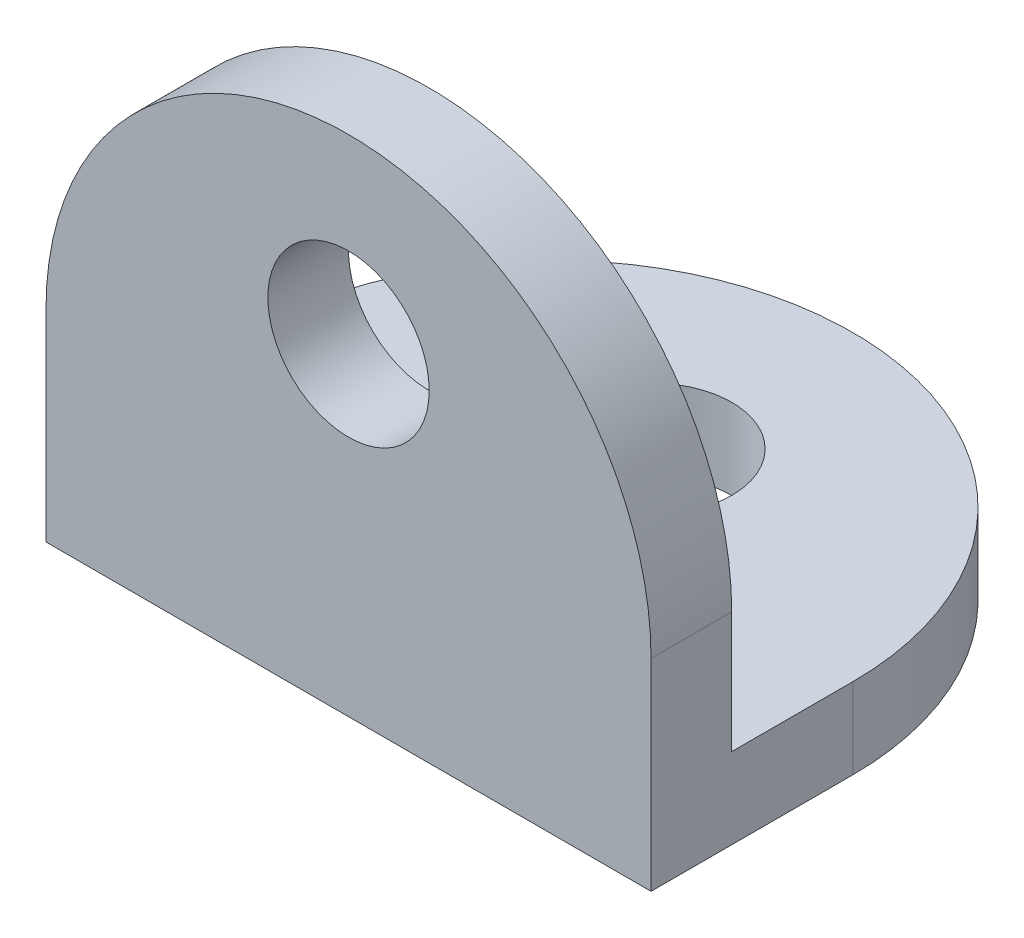
ISO-10303-21;
HEADER;
FILE_DESCRIPTION(('STEP AP214'),'2;1');
FILE_NAME('part.step','',(''),(''),'','','');
FILE_SCHEMA(('AUTOMOTIVE_DESIGN { 1 0 10303 214 1 1 1 1 }'));
ENDSEC;
DATA;
#1=APPLICATION_CONTEXT('core data for automotive mechanical design processes');
#2=APPLICATION_PROTOCOL_DEFINITION('international standard','automotive_design',2000,#1);
#3=PRODUCT_CONTEXT('',#1,'mechanical');
#4=PRODUCT('Part','Part','',(#3));
#5=PRODUCT_RELATED_PRODUCT_CATEGORY('part','',(#4));
#6=PRODUCT_DEFINITION_FORMATION('','',#4);
#7=PRODUCT_DEFINITION_CONTEXT('part definition',#1,'design');
#8=PRODUCT_DEFINITION('design','',#6,#7);
#9=PRODUCT_DEFINITION_SHAPE('','',#8);
#10=(LENGTH_UNIT() NAMED_UNIT(*) SI_UNIT(.MILLI.,.METRE.));
#11=(NAMED_UNIT(*) PLANE_ANGLE_UNIT() SI_UNIT($,.RADIAN.));
#12=(NAMED_UNIT(*) SI_UNIT($,.STERADIAN.) SOLID_ANGLE_UNIT());
#13=UNCERTAINTY_MEASURE_WITH_UNIT(LENGTH_MEASURE(1.E-05),#10,'distance_accuracy_value','');
#14=(GEOMETRIC_REPRESENTATION_CONTEXT(3) GLOBAL_UNCERTAINTY_ASSIGNED_CONTEXT((#13)) GLOBAL_UNIT_ASSIGNED_CONTEXT((#10,
#11,#12)) REPRESENTATION_CONTEXT('',''));
#15=CARTESIAN_POINT('',(0.,0.,0.));
#16=DIRECTION('',(0.,0.,1.));
#17=DIRECTION('',(1.,0.,0.));
#18=AXIS2_PLACEMENT_3D('',#15,#16,#17);
#19=CARTESIAN_POINT('',(0.,2.,0.));
#20=DIRECTION('',(0.,1.,0.));
#21=DIRECTION('',(0.,0.,1.));
#22=AXIS2_PLACEMENT_3D('',#19,#20,#21);
#23=PLANE('',#22);
#24=CARTESIAN_POINT('',(0.,2.,-7.5));
#25=DIRECTION('',(0.,1.,0.));
#26=DIRECTION('',(0.,0.,1.));
#27=AXIS2_PLACEMENT_3D('',#24,#25,#26);
#28=CIRCLE('',#27,2.);
#29=CARTESIAN_POINT('',(0.,2.,-5.5));
#30=VERTEX_POINT('',#29);
#31=EDGE_CURVE('E138',#30,#30,#28,.T.);
#32=ORIENTED_EDGE('',*,*,#31,.F.);
#33=EDGE_LOOP('',(#32));
#34=FACE_BOUND('',#33,.T.);
#35=DIRECTION('',(0.,0.,1.));
#36=VECTOR('',#35,1.);
#37=CARTESIAN_POINT('',(-7.5,2.,0.));
#38=LINE('',#37,#36);
#39=CARTESIAN_POINT('',(-7.5,2.,-5.));
#40=VERTEX_POINT('',#39);
#41=CARTESIAN_POINT('',(-7.5,2.,-2.));
#42=VERTEX_POINT('',#41);
#43=EDGE_CURVE('E60',#40,#42,#38,.T.);
#44=ORIENTED_EDGE('',*,*,#43,.T.);
#45=DIRECTION('',(1.,0.,0.));
#46=VECTOR('',#45,1.);
#47=CARTESIAN_POINT('',(0.,2.,-2.));
#48=LINE('',#47,#46);
#49=CARTESIAN_POINT('',(7.5,2.,-2.));
#50=VERTEX_POINT('',#49);
#51=EDGE_CURVE('E55',#42,#50,#48,.T.);
#52=ORIENTED_EDGE('',*,*,#51,.T.);
#53=DIRECTION('',(0.,0.,1.));
#54=VECTOR('',#53,1.);
#55=CARTESIAN_POINT('',(7.5,2.,0.));
#56=LINE('',#55,#54);
#57=CARTESIAN_POINT('',(7.5,2.,-5.));
#58=VERTEX_POINT('',#57);
#59=EDGE_CURVE('E118',#58,#50,#56,.T.);
#60=ORIENTED_EDGE('',*,*,#59,.F.);
#61=CARTESIAN_POINT('',(0.,2.,-5.));
#62=DIRECTION('',(0.,1.,0.));
#63=DIRECTION('',(0.,0.,1.));
#64=AXIS2_PLACEMENT_3D('',#61,#62,#63);
#65=CIRCLE('',#64,7.5);
#66=EDGE_CURVE('E142',#40,#58,#65,.F.);
#67=ORIENTED_EDGE('',*,*,#66,.F.);
#68=EDGE_LOOP('',(#44,#52,#60,#67));
#69=FACE_BOUND('',#68,.T.);
#70=ADVANCED_FACE('F39',(#34,#69),#23,.T.);
#71=CARTESIAN_POINT('',(0.,2.,-5.));
#72=DIRECTION('',(0.,-1.,0.));
#73=DIRECTION('',(0.,0.,-1.));
#74=AXIS2_PLACEMENT_3D('',#71,#72,#73);
#75=CYLINDRICAL_SURFACE('',#74,7.5);
#76=CARTESIAN_POINT('',(0.,0.,-5.));
#77=DIRECTION('',(0.,1.,0.));
#78=DIRECTION('',(0.,0.,1.));
#79=AXIS2_PLACEMENT_3D('',#76,#77,#78);
#80=CIRCLE('',#79,7.5);
#81=CARTESIAN_POINT('',(-7.5,0.,-5.));
#82=VERTEX_POINT('',#81);
#83=CARTESIAN_POINT('',(7.5,0.,-5.));
#84=VERTEX_POINT('',#83);
#85=EDGE_CURVE('E155',#82,#84,#80,.F.);
#86=ORIENTED_EDGE('',*,*,#85,.F.);
#87=DIRECTION('',(0.,-1.,0.));
#88=VECTOR('',#87,1.);
#89=CARTESIAN_POINT('',(-7.5,2.,-5.));
#90=LINE('',#89,#88);
#91=EDGE_CURVE('E11',#40,#82,#90,.T.);
#92=ORIENTED_EDGE('',*,*,#91,.F.);
#93=ORIENTED_EDGE('',*,*,#66,.T.);
#94=DIRECTION('',(0.,-1.,0.));
#95=VECTOR('',#94,1.);
#96=CARTESIAN_POINT('',(7.5,2.,-5.));
#97=LINE('',#96,#95);
#98=EDGE_CURVE('E151',#58,#84,#97,.T.);
#99=ORIENTED_EDGE('',*,*,#98,.T.);
#100=EDGE_LOOP('',(#86,#92,#93,#99));
#101=FACE_BOUND('',#100,.T.);
#102=ADVANCED_FACE('F187',(#101),#75,.T.);
#103=CARTESIAN_POINT('',(-7.5,2.,0.));
#104=DIRECTION('',(1.,0.,0.));
#105=DIRECTION('',(0.,0.,-1.));
#106=AXIS2_PLACEMENT_3D('',#103,#104,#105);
#107=PLANE('',#106);
#108=DIRECTION('',(0.,-1.,0.));
#109=VECTOR('',#108,1.);
#110=CARTESIAN_POINT('',(-7.5,2.,0.));
#111=LINE('',#110,#109);
#112=CARTESIAN_POINT('',(-7.5,5.,0.));
#113=VERTEX_POINT('',#112);
#114=CARTESIAN_POINT('',(-7.5,0.,0.));
#115=VERTEX_POINT('',#114);
#116=EDGE_CURVE('E48',#113,#115,#111,.T.);
#117=ORIENTED_EDGE('',*,*,#116,.F.);
#118=DIRECTION('',(0.,0.,1.));
#119=VECTOR('',#118,1.);
#120=CARTESIAN_POINT('',(-7.5,5.,-2.));
#121=LINE('',#120,#119);
#122=CARTESIAN_POINT('',(-7.5,5.,-2.));
#123=VERTEX_POINT('',#122);
#124=EDGE_CURVE('E114',#123,#113,#121,.T.);
#125=ORIENTED_EDGE('',*,*,#124,.F.);
#126=DIRECTION('',(0.,-1.,0.));
#127=VECTOR('',#126,1.);
#128=CARTESIAN_POINT('',(-7.5,0.,-2.));
#129=LINE('',#128,#127);
#130=EDGE_CURVE('E100',#123,#42,#129,.T.);
#131=ORIENTED_EDGE('',*,*,#130,.T.);
#132=ORIENTED_EDGE('',*,*,#43,.F.);
#133=ORIENTED_EDGE('',*,*,#91,.T.);
#134=DIRECTION('',(0.,0.,1.));
#135=VECTOR('',#134,1.);
#136=CARTESIAN_POINT('',(-7.5,0.,0.));
#137=LINE('',#136,#135);
#138=EDGE_CURVE('E159',#82,#115,#137,.T.);
#139=ORIENTED_EDGE('',*,*,#138,.T.);
#140=EDGE_LOOP('',(#117,#125,#131,#132,#133,#139));
#141=FACE_BOUND('',#140,.T.);
#142=ADVANCED_FACE('F179',(#141),#107,.F.);
#143=CARTESIAN_POINT('',(0.,2.,0.));
#144=DIRECTION('',(0.,0.,-1.));
#145=DIRECTION('',(-1.,0.,0.));
#146=AXIS2_PLACEMENT_3D('',#143,#144,#145);
#147=PLANE('',#146);
#148=DIRECTION('',(1.,0.,0.));
#149=VECTOR('',#148,1.);
#150=CARTESIAN_POINT('',(0.,0.,0.));
#151=LINE('',#150,#149);
#152=CARTESIAN_POINT('',(7.5,0.,0.));
#153=VERTEX_POINT('',#152);
#154=EDGE_CURVE('E162',#115,#153,#151,.T.);
#155=ORIENTED_EDGE('',*,*,#154,.T.);
#156=DIRECTION('',(0.,-1.,0.));
#157=VECTOR('',#156,1.);
#158=CARTESIAN_POINT('',(7.5,2.,0.));
#159=LINE('',#158,#157);
#160=CARTESIAN_POINT('',(7.5,5.,0.));
#161=VERTEX_POINT('',#160);
#162=EDGE_CURVE('E170',#161,#153,#159,.T.);
#163=ORIENTED_EDGE('',*,*,#162,.F.);
#164=CARTESIAN_POINT('',(0.,5.,0.));
#165=DIRECTION('',(0.,0.,1.));
#166=DIRECTION('',(1.,0.,0.));
#167=AXIS2_PLACEMENT_3D('',#164,#165,#166);
#168=CIRCLE('',#167,7.5);
#169=EDGE_CURVE('E110',#113,#161,#168,.F.);
#170=ORIENTED_EDGE('',*,*,#169,.F.);
#171=ORIENTED_EDGE('',*,*,#116,.T.);
#172=EDGE_LOOP('',(#155,#163,#170,#171));
#173=FACE_BOUND('',#172,.T.);
#174=CARTESIAN_POINT('',(0.,8.,0.));
#175=DIRECTION('',(0.,0.,1.));
#176=DIRECTION('',(1.,0.,0.));
#177=AXIS2_PLACEMENT_3D('',#174,#175,#176);
#178=CIRCLE('',#177,2.);
#179=CARTESIAN_POINT('',(2.,8.,0.));
#180=VERTEX_POINT('',#179);
#181=EDGE_CURVE('E120',#180,#180,#178,.T.);
#182=ORIENTED_EDGE('',*,*,#181,.F.);
#183=EDGE_LOOP('',(#182));
#184=FACE_BOUND('',#183,.T.);
#185=ADVANCED_FACE('F175',(#173,#184),#147,.F.);
#186=CARTESIAN_POINT('',(0.,2.,-7.5));
#187=DIRECTION('',(0.,-1.,0.));
#188=DIRECTION('',(0.,0.,-1.));
#189=AXIS2_PLACEMENT_3D('',#186,#187,#188);
#190=CYLINDRICAL_SURFACE('',#189,2.);
#191=ORIENTED_EDGE('',*,*,#31,.T.);
#192=EDGE_LOOP('',(#191));
#193=FACE_BOUND('',#192,.T.);
#194=CARTESIAN_POINT('',(0.,0.,-7.5));
#195=DIRECTION('',(0.,1.,0.));
#196=DIRECTION('',(0.,0.,1.));
#197=AXIS2_PLACEMENT_3D('',#194,#195,#196);
#198=CIRCLE('',#197,2.);
#199=CARTESIAN_POINT('',(0.,0.,-5.5));
#200=VERTEX_POINT('',#199);
#201=EDGE_CURVE('E137',#200,#200,#198,.T.);
#202=ORIENTED_EDGE('',*,*,#201,.F.);
#203=EDGE_LOOP('',(#202));
#204=FACE_BOUND('',#203,.T.);
#205=ADVANCED_FACE('F41',(#193,#204),#190,.F.);
#206=CARTESIAN_POINT('',(7.5,2.,0.));
#207=DIRECTION('',(1.,0.,0.));
#208=DIRECTION('',(0.,0.,-1.));
#209=AXIS2_PLACEMENT_3D('',#206,#207,#208);
#210=PLANE('',#209);
#211=ORIENTED_EDGE('',*,*,#162,.T.);
#212=DIRECTION('',(0.,0.,1.));
#213=VECTOR('',#212,1.);
#214=CARTESIAN_POINT('',(7.5,0.,0.));
#215=LINE('',#214,#213);
#216=EDGE_CURVE('E143',#84,#153,#215,.T.);
#217=ORIENTED_EDGE('',*,*,#216,.F.);
#218=ORIENTED_EDGE('',*,*,#98,.F.);
#219=ORIENTED_EDGE('',*,*,#59,.T.);
#220=DIRECTION('',(0.,-1.,0.));
#221=VECTOR('',#220,1.);
#222=CARTESIAN_POINT('',(7.5,0.,-2.));
#223=LINE('',#222,#221);
#224=CARTESIAN_POINT('',(7.5,5.,-2.));
#225=VERTEX_POINT('',#224);
#226=EDGE_CURVE('E98',#225,#50,#223,.T.);
#227=ORIENTED_EDGE('',*,*,#226,.F.);
#228=DIRECTION('',(0.,0.,1.));
#229=VECTOR('',#228,1.);
#230=CARTESIAN_POINT('',(7.5,5.,-2.));
#231=LINE('',#230,#229);
#232=EDGE_CURVE('E107',#225,#161,#231,.T.);
#233=ORIENTED_EDGE('',*,*,#232,.T.);
#234=EDGE_LOOP('',(#211,#217,#218,#219,#227,#233));
#235=FACE_BOUND('',#234,.T.);
#236=ADVANCED_FACE('F117',(#235),#210,.T.);
#237=CARTESIAN_POINT('',(0.,0.,0.));
#238=DIRECTION('',(0.,1.,0.));
#239=DIRECTION('',(0.,0.,1.));
#240=AXIS2_PLACEMENT_3D('',#237,#238,#239);
#241=PLANE('',#240);
#242=ORIENTED_EDGE('',*,*,#154,.F.);
#243=ORIENTED_EDGE('',*,*,#138,.F.);
#244=ORIENTED_EDGE('',*,*,#85,.T.);
#245=ORIENTED_EDGE('',*,*,#216,.T.);
#246=EDGE_LOOP('',(#242,#243,#244,#245));
#247=FACE_BOUND('',#246,.T.);
#248=ORIENTED_EDGE('',*,*,#201,.T.);
#249=EDGE_LOOP('',(#248));
#250=FACE_BOUND('',#249,.T.);
#251=ADVANCED_FACE('F183',(#247,#250),#241,.F.);
#252=CARTESIAN_POINT('',(0.,5.,-2.));
#253=DIRECTION('',(0.,0.,1.));
#254=DIRECTION('',(1.,0.,0.));
#255=AXIS2_PLACEMENT_3D('',#252,#253,#254);
#256=CYLINDRICAL_SURFACE('',#255,7.5);
#257=ORIENTED_EDGE('',*,*,#169,.T.);
#258=ORIENTED_EDGE('',*,*,#232,.F.);
#259=CARTESIAN_POINT('',(0.,5.,-2.));
#260=DIRECTION('',(0.,0.,1.));
#261=DIRECTION('',(1.,0.,0.));
#262=AXIS2_PLACEMENT_3D('',#259,#260,#261);
#263=CIRCLE('',#262,7.5);
#264=EDGE_CURVE('E93',#123,#225,#263,.F.);
#265=ORIENTED_EDGE('',*,*,#264,.F.);
#266=ORIENTED_EDGE('',*,*,#124,.T.);
#267=EDGE_LOOP('',(#257,#258,#265,#266));
#268=FACE_BOUND('',#267,.T.);
#269=ADVANCED_FACE('F108',(#268),#256,.T.);
#270=CARTESIAN_POINT('',(0.,8.,-2.));
#271=DIRECTION('',(0.,0.,1.));
#272=DIRECTION('',(1.,0.,0.));
#273=AXIS2_PLACEMENT_3D('',#270,#271,#272);
#274=CYLINDRICAL_SURFACE('',#273,2.);
#275=CARTESIAN_POINT('',(0.,8.,-2.));
#276=DIRECTION('',(0.,0.,1.));
#277=DIRECTION('',(1.,0.,0.));
#278=AXIS2_PLACEMENT_3D('',#275,#276,#277);
#279=CIRCLE('',#278,2.);
#280=CARTESIAN_POINT('',(2.,8.,-2.));
#281=VERTEX_POINT('',#280);
#282=EDGE_CURVE('E115',#281,#281,#279,.T.);
#283=ORIENTED_EDGE('',*,*,#282,.F.);
#284=EDGE_LOOP('',(#283));
#285=FACE_BOUND('',#284,.T.);
#286=ORIENTED_EDGE('',*,*,#181,.T.);
#287=EDGE_LOOP('',(#286));
#288=FACE_BOUND('',#287,.T.);
#289=ADVANCED_FACE('F233',(#285,#288),#274,.F.);
#290=CARTESIAN_POINT('',(0.,0.,-2.));
#291=DIRECTION('',(0.,0.,1.));
#292=DIRECTION('',(1.,0.,0.));
#293=AXIS2_PLACEMENT_3D('',#290,#291,#292);
#294=PLANE('',#293);
#295=ORIENTED_EDGE('',*,*,#51,.F.);
#296=ORIENTED_EDGE('',*,*,#130,.F.);
#297=ORIENTED_EDGE('',*,*,#264,.T.);
#298=ORIENTED_EDGE('',*,*,#226,.T.);
#299=EDGE_LOOP('',(#295,#296,#297,#298));
#300=FACE_BOUND('',#299,.T.);
#301=ORIENTED_EDGE('',*,*,#282,.T.);
#302=EDGE_LOOP('',(#301));
#303=FACE_BOUND('',#302,.T.);
#304=ADVANCED_FACE('F95',(#300,#303),#294,.F.);
#305=CLOSED_SHELL('',(#70,#102,#142,#185,#205,#236,#251,#269,#289,#304));
#306=MANIFOLD_SOLID_BREP('B2',#305);
#307=ADVANCED_BREP_SHAPE_REPRESENTATION('',(#18,#306),#14);
#308=SHAPE_DEFINITION_REPRESENTATION(#9,#307);
ENDSEC;
END-ISO-10303-21;
